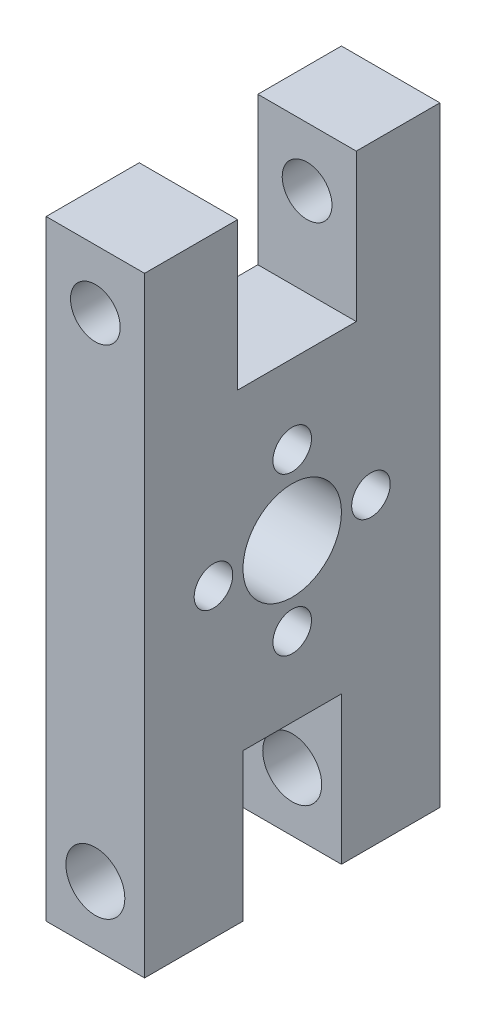
ISO-10303-21;
HEADER;
FILE_DESCRIPTION(('STEP AP214'),'2;1');
FILE_NAME('part.step','',(''),(''),'','','');
FILE_SCHEMA(('AUTOMOTIVE_DESIGN { 1 0 10303 214 1 1 1 1 }'));
ENDSEC;
DATA;
#1=APPLICATION_CONTEXT('core data for automotive mechanical design processes');
#2=APPLICATION_PROTOCOL_DEFINITION('international standard','automotive_design',2000,#1);
#3=PRODUCT_CONTEXT('',#1,'mechanical');
#4=PRODUCT('Part','Part','',(#3));
#5=PRODUCT_RELATED_PRODUCT_CATEGORY('part','',(#4));
#6=PRODUCT_DEFINITION_FORMATION('','',#4);
#7=PRODUCT_DEFINITION_CONTEXT('part definition',#1,'design');
#8=PRODUCT_DEFINITION('design','',#6,#7);
#9=PRODUCT_DEFINITION_SHAPE('','',#8);
#10=(LENGTH_UNIT() NAMED_UNIT(*) SI_UNIT(.MILLI.,.METRE.));
#11=(NAMED_UNIT(*) PLANE_ANGLE_UNIT() SI_UNIT($,.RADIAN.));
#12=(NAMED_UNIT(*) SI_UNIT($,.STERADIAN.) SOLID_ANGLE_UNIT());
#13=UNCERTAINTY_MEASURE_WITH_UNIT(LENGTH_MEASURE(1.E-05),#10,'distance_accuracy_value','');
#14=(GEOMETRIC_REPRESENTATION_CONTEXT(3) GLOBAL_UNCERTAINTY_ASSIGNED_CONTEXT((#13)) GLOBAL_UNIT_ASSIGNED_CONTEXT((#10,
#11,#12)) REPRESENTATION_CONTEXT('',''));
#15=CARTESIAN_POINT('',(0.,0.,0.));
#16=DIRECTION('',(0.,0.,1.));
#17=DIRECTION('',(1.,0.,0.));
#18=AXIS2_PLACEMENT_3D('',#15,#16,#17);
#19=CARTESIAN_POINT('',(10.,0.,0.));
#20=DIRECTION('',(-1.,0.,0.));
#21=DIRECTION('',(0.,0.,1.));
#22=AXIS2_PLACEMENT_3D('',#19,#20,#21);
#23=PLANE('',#22);
#24=DIRECTION('',(0.,0.,1.));
#25=VECTOR('',#24,1.);
#26=CARTESIAN_POINT('',(10.,31.,5.5420552748366));
#27=LINE('',#26,#25);
#28=CARTESIAN_POINT('',(10.,31.,5.5420552748366));
#29=VERTEX_POINT('',#28);
#30=CARTESIAN_POINT('',(10.,31.,15.));
#31=VERTEX_POINT('',#30);
#32=EDGE_CURVE('E191',#29,#31,#27,.T.);
#33=ORIENTED_EDGE('',*,*,#32,.T.);
#34=DIRECTION('',(0.,-1.,0.));
#35=VECTOR('',#34,1.);
#36=CARTESIAN_POINT('',(10.,-31.,15.));
#37=LINE('',#36,#35);
#38=CARTESIAN_POINT('',(10.,-31.,15.));
#39=VERTEX_POINT('',#38);
#40=EDGE_CURVE('E119',#31,#39,#37,.T.);
#41=ORIENTED_EDGE('',*,*,#40,.T.);
#42=DIRECTION('',(0.,0.,-1.));
#43=VECTOR('',#42,1.);
#44=CARTESIAN_POINT('',(10.,-31.,5.));
#45=LINE('',#44,#43);
#46=CARTESIAN_POINT('',(10.,-31.,5.));
#47=VERTEX_POINT('',#46);
#48=EDGE_CURVE('E219',#39,#47,#45,.T.);
#49=ORIENTED_EDGE('',*,*,#48,.T.);
#50=DIRECTION('',(0.,1.,0.));
#51=VECTOR('',#50,1.);
#52=CARTESIAN_POINT('',(10.,-31.,5.));
#53=LINE('',#52,#51);
#54=CARTESIAN_POINT('',(10.,-16.,5.));
#55=VERTEX_POINT('',#54);
#56=EDGE_CURVE('E238',#47,#55,#53,.T.);
#57=ORIENTED_EDGE('',*,*,#56,.T.);
#58=DIRECTION('',(0.,0.,-1.));
#59=VECTOR('',#58,1.);
#60=CARTESIAN_POINT('',(10.,-16.,5.));
#61=LINE('',#60,#59);
#62=CARTESIAN_POINT('',(10.,-16.,-5.));
#63=VERTEX_POINT('',#62);
#64=EDGE_CURVE('E235',#55,#63,#61,.T.);
#65=ORIENTED_EDGE('',*,*,#64,.T.);
#66=DIRECTION('',(0.,-1.,0.));
#67=VECTOR('',#66,1.);
#68=CARTESIAN_POINT('',(10.,-31.,-5.));
#69=LINE('',#68,#67);
#70=CARTESIAN_POINT('',(10.,-31.,-5.));
#71=VERTEX_POINT('',#70);
#72=EDGE_CURVE('E237',#63,#71,#69,.T.);
#73=ORIENTED_EDGE('',*,*,#72,.T.);
#74=DIRECTION('',(0.,0.,-1.));
#75=VECTOR('',#74,1.);
#76=CARTESIAN_POINT('',(10.,-31.,-15.));
#77=LINE('',#76,#75);
#78=CARTESIAN_POINT('',(10.,-31.,-15.));
#79=VERTEX_POINT('',#78);
#80=EDGE_CURVE('E240',#71,#79,#77,.T.);
#81=ORIENTED_EDGE('',*,*,#80,.T.);
#82=DIRECTION('',(0.,1.,0.));
#83=VECTOR('',#82,1.);
#84=CARTESIAN_POINT('',(10.,-31.,-15.));
#85=LINE('',#84,#83);
#86=CARTESIAN_POINT('',(10.,31.,-15.));
#87=VERTEX_POINT('',#86);
#88=EDGE_CURVE('E246',#79,#87,#85,.T.);
#89=ORIENTED_EDGE('',*,*,#88,.T.);
#90=DIRECTION('',(0.,0.,1.));
#91=VECTOR('',#90,1.);
#92=CARTESIAN_POINT('',(10.,31.,-15.));
#93=LINE('',#92,#91);
#94=CARTESIAN_POINT('',(10.,31.,-6.50834206963784));
#95=VERTEX_POINT('',#94);
#96=EDGE_CURVE('E150',#87,#95,#93,.T.);
#97=ORIENTED_EDGE('',*,*,#96,.T.);
#98=DIRECTION('',(0.,-1.,0.));
#99=VECTOR('',#98,1.);
#100=CARTESIAN_POINT('',(10.,31.,-6.50834206963784));
#101=LINE('',#100,#99);
#102=CARTESIAN_POINT('',(10.,16.,-6.50834206963784));
#103=VERTEX_POINT('',#102);
#104=EDGE_CURVE('E144',#95,#103,#101,.T.);
#105=ORIENTED_EDGE('',*,*,#104,.T.);
#106=DIRECTION('',(0.,0.,1.));
#107=VECTOR('',#106,1.);
#108=CARTESIAN_POINT('',(10.,16.,5.54205527483666));
#109=LINE('',#108,#107);
#110=CARTESIAN_POINT('',(10.,16.,5.54205527483666));
#111=VERTEX_POINT('',#110);
#112=EDGE_CURVE('E148',#103,#111,#109,.T.);
#113=ORIENTED_EDGE('',*,*,#112,.T.);
#114=DIRECTION('',(0.,1.,0.));
#115=VECTOR('',#114,1.);
#116=CARTESIAN_POINT('',(10.,31.,5.5420552748366));
#117=LINE('',#116,#115);
#118=EDGE_CURVE('E64',#111,#29,#117,.T.);
#119=ORIENTED_EDGE('',*,*,#118,.T.);
#120=EDGE_LOOP('',(#33,#41,#49,#57,#65,#73,#81,#89,#97,#105,#113,#119));
#121=FACE_BOUND('',#120,.T.);
#122=CARTESIAN_POINT('',(10.,0.,0.));
#123=DIRECTION('',(1.,0.,0.));
#124=DIRECTION('',(0.,0.,-1.));
#125=AXIS2_PLACEMENT_3D('',#122,#123,#124);
#126=CIRCLE('',#125,5.);
#127=CARTESIAN_POINT('',(10.,0.,-5.));
#128=VERTEX_POINT('',#127);
#129=EDGE_CURVE('E172',#128,#128,#126,.T.);
#130=ORIENTED_EDGE('',*,*,#129,.F.);
#131=EDGE_LOOP('',(#130));
#132=FACE_BOUND('',#131,.T.);
#133=CARTESIAN_POINT('',(10.,0.,7.99999999999999));
#134=DIRECTION('',(1.,0.,0.));
#135=DIRECTION('',(0.,0.,-1.));
#136=AXIS2_PLACEMENT_3D('',#133,#134,#135);
#137=CIRCLE('',#136,1.95828142992277);
#138=CARTESIAN_POINT('',(10.,0.,6.04171857007723));
#139=VERTEX_POINT('',#138);
#140=EDGE_CURVE('E353',#139,#139,#137,.T.);
#141=ORIENTED_EDGE('',*,*,#140,.F.);
#142=EDGE_LOOP('',(#141));
#143=FACE_BOUND('',#142,.T.);
#144=CARTESIAN_POINT('',(10.,8.,0.));
#145=DIRECTION('',(1.,0.,0.));
#146=DIRECTION('',(0.,0.,-1.));
#147=AXIS2_PLACEMENT_3D('',#144,#145,#146);
#148=CIRCLE('',#147,1.95828142992276);
#149=CARTESIAN_POINT('',(10.,8.,-1.95828142992279));
#150=VERTEX_POINT('',#149);
#151=EDGE_CURVE('E347',#150,#150,#148,.T.);
#152=ORIENTED_EDGE('',*,*,#151,.F.);
#153=EDGE_LOOP('',(#152));
#154=FACE_BOUND('',#153,.T.);
#155=CARTESIAN_POINT('',(10.,0.,-7.99999999999999));
#156=DIRECTION('',(1.,0.,0.));
#157=DIRECTION('',(0.,0.,-1.));
#158=AXIS2_PLACEMENT_3D('',#155,#156,#157);
#159=CIRCLE('',#158,1.95828142992277);
#160=CARTESIAN_POINT('',(10.,0.,-9.95828142992276));
#161=VERTEX_POINT('',#160);
#162=EDGE_CURVE('E341',#161,#161,#159,.T.);
#163=ORIENTED_EDGE('',*,*,#162,.F.);
#164=EDGE_LOOP('',(#163));
#165=FACE_BOUND('',#164,.T.);
#166=CARTESIAN_POINT('',(10.,-8.,0.));
#167=DIRECTION('',(1.,0.,0.));
#168=DIRECTION('',(0.,0.,-1.));
#169=AXIS2_PLACEMENT_3D('',#166,#167,#168);
#170=CIRCLE('',#169,1.95828142992277);
#171=CARTESIAN_POINT('',(10.,-8.,-1.95828142992268));
#172=VERTEX_POINT('',#171);
#173=EDGE_CURVE('E335',#172,#172,#170,.T.);
#174=ORIENTED_EDGE('',*,*,#173,.F.);
#175=EDGE_LOOP('',(#174));
#176=FACE_BOUND('',#175,.T.);
#177=ADVANCED_FACE('F46',(#121,#132,#143,#154,#165,#176),#23,.F.);
#178=CARTESIAN_POINT('',(0.,0.,0.));
#179=DIRECTION('',(-1.,0.,0.));
#180=DIRECTION('',(0.,0.,1.));
#181=AXIS2_PLACEMENT_3D('',#178,#179,#180);
#182=PLANE('',#181);
#183=CARTESIAN_POINT('',(0.,0.,-7.99999999999999));
#184=DIRECTION('',(1.,0.,0.));
#185=DIRECTION('',(0.,0.,-1.));
#186=AXIS2_PLACEMENT_3D('',#183,#184,#185);
#187=CIRCLE('',#186,1.95828142992277);
#188=CARTESIAN_POINT('',(0.,0.,-9.95828142992276));
#189=VERTEX_POINT('',#188);
#190=EDGE_CURVE('E338',#189,#189,#187,.T.);
#191=ORIENTED_EDGE('',*,*,#190,.T.);
#192=EDGE_LOOP('',(#191));
#193=FACE_BOUND('',#192,.T.);
#194=CARTESIAN_POINT('',(0.,0.,7.99999999999999));
#195=DIRECTION('',(1.,0.,0.));
#196=DIRECTION('',(0.,0.,-1.));
#197=AXIS2_PLACEMENT_3D('',#194,#195,#196);
#198=CIRCLE('',#197,1.95828142992277);
#199=CARTESIAN_POINT('',(0.,0.,6.04171857007723));
#200=VERTEX_POINT('',#199);
#201=EDGE_CURVE('E350',#200,#200,#198,.T.);
#202=ORIENTED_EDGE('',*,*,#201,.T.);
#203=EDGE_LOOP('',(#202));
#204=FACE_BOUND('',#203,.T.);
#205=DIRECTION('',(0.,0.,1.));
#206=VECTOR('',#205,1.);
#207=CARTESIAN_POINT('',(0.,31.,5.5420552748366));
#208=LINE('',#207,#206);
#209=CARTESIAN_POINT('',(0.,31.,5.5420552748366));
#210=VERTEX_POINT('',#209);
#211=CARTESIAN_POINT('',(0.,31.,15.));
#212=VERTEX_POINT('',#211);
#213=EDGE_CURVE('E168',#210,#212,#208,.T.);
#214=ORIENTED_EDGE('',*,*,#213,.F.);
#215=DIRECTION('',(0.,1.,0.));
#216=VECTOR('',#215,1.);
#217=CARTESIAN_POINT('',(0.,31.,5.5420552748366));
#218=LINE('',#217,#216);
#219=CARTESIAN_POINT('',(0.,16.,5.54205527483666));
#220=VERTEX_POINT('',#219);
#221=EDGE_CURVE('E111',#220,#210,#218,.T.);
#222=ORIENTED_EDGE('',*,*,#221,.F.);
#223=DIRECTION('',(0.,0.,1.));
#224=VECTOR('',#223,1.);
#225=CARTESIAN_POINT('',(0.,16.,5.54205527483666));
#226=LINE('',#225,#224);
#227=CARTESIAN_POINT('',(0.,16.,-6.50834206963784));
#228=VERTEX_POINT('',#227);
#229=EDGE_CURVE('E105',#228,#220,#226,.T.);
#230=ORIENTED_EDGE('',*,*,#229,.F.);
#231=DIRECTION('',(0.,-1.,0.));
#232=VECTOR('',#231,1.);
#233=CARTESIAN_POINT('',(0.,31.,-6.50834206963784));
#234=LINE('',#233,#232);
#235=CARTESIAN_POINT('',(0.,31.,-6.50834206963784));
#236=VERTEX_POINT('',#235);
#237=EDGE_CURVE('E158',#236,#228,#234,.T.);
#238=ORIENTED_EDGE('',*,*,#237,.F.);
#239=DIRECTION('',(0.,0.,1.));
#240=VECTOR('',#239,1.);
#241=CARTESIAN_POINT('',(0.,31.,-15.));
#242=LINE('',#241,#240);
#243=CARTESIAN_POINT('',(0.,31.,-15.));
#244=VERTEX_POINT('',#243);
#245=EDGE_CURVE('E186',#244,#236,#242,.T.);
#246=ORIENTED_EDGE('',*,*,#245,.F.);
#247=DIRECTION('',(0.,1.,0.));
#248=VECTOR('',#247,1.);
#249=CARTESIAN_POINT('',(0.,-31.,-15.));
#250=LINE('',#249,#248);
#251=CARTESIAN_POINT('',(0.,-31.,-15.));
#252=VERTEX_POINT('',#251);
#253=EDGE_CURVE('E184',#252,#244,#250,.T.);
#254=ORIENTED_EDGE('',*,*,#253,.F.);
#255=DIRECTION('',(0.,0.,-1.));
#256=VECTOR('',#255,1.);
#257=CARTESIAN_POINT('',(0.,-31.,-15.));
#258=LINE('',#257,#256);
#259=CARTESIAN_POINT('',(0.,-31.,-5.));
#260=VERTEX_POINT('',#259);
#261=EDGE_CURVE('E182',#260,#252,#258,.T.);
#262=ORIENTED_EDGE('',*,*,#261,.F.);
#263=DIRECTION('',(0.,-1.,0.));
#264=VECTOR('',#263,1.);
#265=CARTESIAN_POINT('',(0.,-31.,-5.));
#266=LINE('',#265,#264);
#267=CARTESIAN_POINT('',(0.,-16.,-5.));
#268=VERTEX_POINT('',#267);
#269=EDGE_CURVE('E180',#268,#260,#266,.T.);
#270=ORIENTED_EDGE('',*,*,#269,.F.);
#271=DIRECTION('',(0.,0.,-1.));
#272=VECTOR('',#271,1.);
#273=CARTESIAN_POINT('',(0.,-16.,5.));
#274=LINE('',#273,#272);
#275=CARTESIAN_POINT('',(0.,-16.,5.));
#276=VERTEX_POINT('',#275);
#277=EDGE_CURVE('E178',#276,#268,#274,.T.);
#278=ORIENTED_EDGE('',*,*,#277,.F.);
#279=DIRECTION('',(0.,1.,0.));
#280=VECTOR('',#279,1.);
#281=CARTESIAN_POINT('',(0.,-31.,5.));
#282=LINE('',#281,#280);
#283=CARTESIAN_POINT('',(0.,-31.,5.));
#284=VERTEX_POINT('',#283);
#285=EDGE_CURVE('E176',#284,#276,#282,.T.);
#286=ORIENTED_EDGE('',*,*,#285,.F.);
#287=DIRECTION('',(0.,0.,-1.));
#288=VECTOR('',#287,1.);
#289=CARTESIAN_POINT('',(0.,-31.,5.));
#290=LINE('',#289,#288);
#291=CARTESIAN_POINT('',(0.,-31.,15.));
#292=VERTEX_POINT('',#291);
#293=EDGE_CURVE('E174',#292,#284,#290,.T.);
#294=ORIENTED_EDGE('',*,*,#293,.F.);
#295=DIRECTION('',(0.,-1.,0.));
#296=VECTOR('',#295,1.);
#297=CARTESIAN_POINT('',(0.,-31.,15.));
#298=LINE('',#297,#296);
#299=EDGE_CURVE('E171',#212,#292,#298,.T.);
#300=ORIENTED_EDGE('',*,*,#299,.F.);
#301=EDGE_LOOP('',(#214,#222,#230,#238,#246,#254,#262,#270,#278,#286,#294,#300));
#302=FACE_BOUND('',#301,.T.);
#303=CARTESIAN_POINT('',(0.,0.,0.));
#304=DIRECTION('',(1.,0.,0.));
#305=DIRECTION('',(0.,0.,-1.));
#306=AXIS2_PLACEMENT_3D('',#303,#304,#305);
#307=CIRCLE('',#306,5.);
#308=CARTESIAN_POINT('',(0.,0.,-5.));
#309=VERTEX_POINT('',#308);
#310=EDGE_CURVE('E356',#309,#309,#307,.T.);
#311=ORIENTED_EDGE('',*,*,#310,.T.);
#312=EDGE_LOOP('',(#311));
#313=FACE_BOUND('',#312,.T.);
#314=CARTESIAN_POINT('',(0.,8.,0.));
#315=DIRECTION('',(1.,0.,0.));
#316=DIRECTION('',(0.,0.,-1.));
#317=AXIS2_PLACEMENT_3D('',#314,#315,#316);
#318=CIRCLE('',#317,1.95828142992276);
#319=CARTESIAN_POINT('',(0.,8.,-1.95828142992279));
#320=VERTEX_POINT('',#319);
#321=EDGE_CURVE('E344',#320,#320,#318,.T.);
#322=ORIENTED_EDGE('',*,*,#321,.T.);
#323=EDGE_LOOP('',(#322));
#324=FACE_BOUND('',#323,.T.);
#325=CARTESIAN_POINT('',(0.,-8.,0.));
#326=DIRECTION('',(1.,0.,0.));
#327=DIRECTION('',(0.,0.,-1.));
#328=AXIS2_PLACEMENT_3D('',#325,#326,#327);
#329=CIRCLE('',#328,1.95828142992277);
#330=CARTESIAN_POINT('',(0.,-8.,-1.95828142992268));
#331=VERTEX_POINT('',#330);
#332=EDGE_CURVE('E334',#331,#331,#329,.T.);
#333=ORIENTED_EDGE('',*,*,#332,.T.);
#334=EDGE_LOOP('',(#333));
#335=FACE_BOUND('',#334,.T.);
#336=ADVANCED_FACE('F223',(#193,#204,#302,#313,#324,#335),#182,.T.);
#337=CARTESIAN_POINT('',(10.,31.,5.5420552748366));
#338=DIRECTION('',(0.,-1.,0.));
#339=DIRECTION('',(0.,0.,-1.));
#340=AXIS2_PLACEMENT_3D('',#337,#338,#339);
#341=PLANE('',#340);
#342=ORIENTED_EDGE('',*,*,#213,.T.);
#343=DIRECTION('',(-1.,0.,0.));
#344=VECTOR('',#343,1.);
#345=CARTESIAN_POINT('',(10.,31.,15.));
#346=LINE('',#345,#344);
#347=EDGE_CURVE('E13',#31,#212,#346,.T.);
#348=ORIENTED_EDGE('',*,*,#347,.F.);
#349=ORIENTED_EDGE('',*,*,#32,.F.);
#350=DIRECTION('',(-1.,0.,0.));
#351=VECTOR('',#350,1.);
#352=CARTESIAN_POINT('',(10.,31.,5.5420552748366));
#353=LINE('',#352,#351);
#354=EDGE_CURVE('E164',#29,#210,#353,.T.);
#355=ORIENTED_EDGE('',*,*,#354,.T.);
#356=EDGE_LOOP('',(#342,#348,#349,#355));
#357=FACE_BOUND('',#356,.T.);
#358=ADVANCED_FACE('F48',(#357),#341,.F.);
#359=CARTESIAN_POINT('',(10.,-31.,15.));
#360=DIRECTION('',(0.,0.,-1.));
#361=DIRECTION('',(-1.,0.,0.));
#362=AXIS2_PLACEMENT_3D('',#359,#360,#361);
#363=PLANE('',#362);
#364=CARTESIAN_POINT('',(5.,-25.,15.));
#365=DIRECTION('',(0.,0.,1.));
#366=DIRECTION('',(1.,0.,0.));
#367=AXIS2_PLACEMENT_3D('',#364,#365,#366);
#368=CIRCLE('',#367,2.99463892889007);
#369=CARTESIAN_POINT('',(7.99463892889008,-25.,15.));
#370=VERTEX_POINT('',#369);
#371=EDGE_CURVE('E313',#370,#370,#368,.T.);
#372=ORIENTED_EDGE('',*,*,#371,.F.);
#373=EDGE_LOOP('',(#372));
#374=FACE_BOUND('',#373,.T.);
#375=CARTESIAN_POINT('',(5.,25.,15.));
#376=DIRECTION('',(0.,0.,1.));
#377=DIRECTION('',(1.,0.,0.));
#378=AXIS2_PLACEMENT_3D('',#375,#376,#377);
#379=CIRCLE('',#378,2.5264474911645);
#380=CARTESIAN_POINT('',(7.52644749116451,25.,15.));
#381=VERTEX_POINT('',#380);
#382=EDGE_CURVE('E318',#381,#381,#379,.T.);
#383=ORIENTED_EDGE('',*,*,#382,.F.);
#384=EDGE_LOOP('',(#383));
#385=FACE_BOUND('',#384,.T.);
#386=ORIENTED_EDGE('',*,*,#299,.T.);
#387=DIRECTION('',(-1.,0.,0.));
#388=VECTOR('',#387,1.);
#389=CARTESIAN_POINT('',(10.,-31.,15.));
#390=LINE('',#389,#388);
#391=EDGE_CURVE('E56',#39,#292,#390,.T.);
#392=ORIENTED_EDGE('',*,*,#391,.F.);
#393=ORIENTED_EDGE('',*,*,#40,.F.);
#394=ORIENTED_EDGE('',*,*,#347,.T.);
#395=EDGE_LOOP('',(#386,#392,#393,#394));
#396=FACE_BOUND('',#395,.T.);
#397=ADVANCED_FACE('F396',(#374,#385,#396),#363,.F.);
#398=CARTESIAN_POINT('',(10.,-31.,5.));
#399=DIRECTION('',(0.,1.,0.));
#400=DIRECTION('',(0.,0.,1.));
#401=AXIS2_PLACEMENT_3D('',#398,#399,#400);
#402=PLANE('',#401);
#403=ORIENTED_EDGE('',*,*,#293,.T.);
#404=DIRECTION('',(-1.,0.,0.));
#405=VECTOR('',#404,1.);
#406=CARTESIAN_POINT('',(10.,-31.,5.));
#407=LINE('',#406,#405);
#408=EDGE_CURVE('E210',#47,#284,#407,.T.);
#409=ORIENTED_EDGE('',*,*,#408,.F.);
#410=ORIENTED_EDGE('',*,*,#48,.F.);
#411=ORIENTED_EDGE('',*,*,#391,.T.);
#412=EDGE_LOOP('',(#403,#409,#410,#411));
#413=FACE_BOUND('',#412,.T.);
#414=ADVANCED_FACE('F217',(#413),#402,.F.);
#415=CARTESIAN_POINT('',(10.,-31.,5.));
#416=DIRECTION('',(0.,0.,1.));
#417=DIRECTION('',(1.,0.,0.));
#418=AXIS2_PLACEMENT_3D('',#415,#416,#417);
#419=PLANE('',#418);
#420=CARTESIAN_POINT('',(5.,-25.,5.));
#421=DIRECTION('',(0.,0.,1.));
#422=DIRECTION('',(1.,0.,0.));
#423=AXIS2_PLACEMENT_3D('',#420,#421,#422);
#424=CIRCLE('',#423,2.99463892889007);
#425=CARTESIAN_POINT('',(7.99463892889008,-25.,5.));
#426=VERTEX_POINT('',#425);
#427=EDGE_CURVE('E316',#426,#426,#424,.T.);
#428=ORIENTED_EDGE('',*,*,#427,.T.);
#429=EDGE_LOOP('',(#428));
#430=FACE_BOUND('',#429,.T.);
#431=ORIENTED_EDGE('',*,*,#285,.T.);
#432=DIRECTION('',(-1.,0.,0.));
#433=VECTOR('',#432,1.);
#434=CARTESIAN_POINT('',(10.,-16.,5.));
#435=LINE('',#434,#433);
#436=EDGE_CURVE('E207',#55,#276,#435,.T.);
#437=ORIENTED_EDGE('',*,*,#436,.F.);
#438=ORIENTED_EDGE('',*,*,#56,.F.);
#439=ORIENTED_EDGE('',*,*,#408,.T.);
#440=EDGE_LOOP('',(#431,#437,#438,#439));
#441=FACE_BOUND('',#440,.T.);
#442=ADVANCED_FACE('F229',(#430,#441),#419,.F.);
#443=CARTESIAN_POINT('',(10.,-16.,5.));
#444=DIRECTION('',(0.,1.,0.));
#445=DIRECTION('',(0.,0.,1.));
#446=AXIS2_PLACEMENT_3D('',#443,#444,#445);
#447=PLANE('',#446);
#448=ORIENTED_EDGE('',*,*,#277,.T.);
#449=DIRECTION('',(-1.,0.,0.));
#450=VECTOR('',#449,1.);
#451=CARTESIAN_POINT('',(10.,-16.,-5.));
#452=LINE('',#451,#450);
#453=EDGE_CURVE('E204',#63,#268,#452,.T.);
#454=ORIENTED_EDGE('',*,*,#453,.F.);
#455=ORIENTED_EDGE('',*,*,#64,.F.);
#456=ORIENTED_EDGE('',*,*,#436,.T.);
#457=EDGE_LOOP('',(#448,#454,#455,#456));
#458=FACE_BOUND('',#457,.T.);
#459=ADVANCED_FACE('F233',(#458),#447,.F.);
#460=CARTESIAN_POINT('',(10.,-31.,-5.));
#461=DIRECTION('',(0.,0.,-1.));
#462=DIRECTION('',(-1.,0.,0.));
#463=AXIS2_PLACEMENT_3D('',#460,#461,#462);
#464=PLANE('',#463);
#465=CARTESIAN_POINT('',(5.,-25.,-5.));
#466=DIRECTION('',(0.,0.,-1.));
#467=DIRECTION('',(-1.,0.,0.));
#468=AXIS2_PLACEMENT_3D('',#465,#466,#467);
#469=CIRCLE('',#468,2.99463892889007);
#470=CARTESIAN_POINT('',(2.00536107110993,-25.,-5.));
#471=VERTEX_POINT('',#470);
#472=EDGE_CURVE('E319',#471,#471,#469,.T.);
#473=ORIENTED_EDGE('',*,*,#472,.T.);
#474=EDGE_LOOP('',(#473));
#475=FACE_BOUND('',#474,.T.);
#476=ORIENTED_EDGE('',*,*,#269,.T.);
#477=DIRECTION('',(-1.,0.,0.));
#478=VECTOR('',#477,1.);
#479=CARTESIAN_POINT('',(10.,-31.,-5.));
#480=LINE('',#479,#478);
#481=EDGE_CURVE('E201',#71,#260,#480,.T.);
#482=ORIENTED_EDGE('',*,*,#481,.F.);
#483=ORIENTED_EDGE('',*,*,#72,.F.);
#484=ORIENTED_EDGE('',*,*,#453,.T.);
#485=EDGE_LOOP('',(#476,#482,#483,#484));
#486=FACE_BOUND('',#485,.T.);
#487=ADVANCED_FACE('F409',(#475,#486),#464,.F.);
#488=CARTESIAN_POINT('',(10.,-31.,-15.));
#489=DIRECTION('',(0.,1.,0.));
#490=DIRECTION('',(0.,0.,1.));
#491=AXIS2_PLACEMENT_3D('',#488,#489,#490);
#492=PLANE('',#491);
#493=ORIENTED_EDGE('',*,*,#261,.T.);
#494=DIRECTION('',(-1.,0.,0.));
#495=VECTOR('',#494,1.);
#496=CARTESIAN_POINT('',(10.,-31.,-15.));
#497=LINE('',#496,#495);
#498=EDGE_CURVE('E198',#79,#252,#497,.T.);
#499=ORIENTED_EDGE('',*,*,#498,.F.);
#500=ORIENTED_EDGE('',*,*,#80,.F.);
#501=ORIENTED_EDGE('',*,*,#481,.T.);
#502=EDGE_LOOP('',(#493,#499,#500,#501));
#503=FACE_BOUND('',#502,.T.);
#504=ADVANCED_FACE('F412',(#503),#492,.F.);
#505=CARTESIAN_POINT('',(10.,-31.,-15.));
#506=DIRECTION('',(0.,0.,1.));
#507=DIRECTION('',(1.,0.,0.));
#508=AXIS2_PLACEMENT_3D('',#505,#506,#507);
#509=PLANE('',#508);
#510=CARTESIAN_POINT('',(5.,-25.,-15.));
#511=DIRECTION('',(0.,0.,1.));
#512=DIRECTION('',(1.,0.,0.));
#513=AXIS2_PLACEMENT_3D('',#510,#511,#512);
#514=CIRCLE('',#513,2.99463892889007);
#515=CARTESIAN_POINT('',(7.99463892889008,-25.,-15.));
#516=VERTEX_POINT('',#515);
#517=EDGE_CURVE('E325',#516,#516,#514,.T.);
#518=ORIENTED_EDGE('',*,*,#517,.T.);
#519=EDGE_LOOP('',(#518));
#520=FACE_BOUND('',#519,.T.);
#521=CARTESIAN_POINT('',(5.,25.,-15.));
#522=DIRECTION('',(0.,0.,1.));
#523=DIRECTION('',(1.,0.,0.));
#524=AXIS2_PLACEMENT_3D('',#521,#522,#523);
#525=CIRCLE('',#524,2.5264474911645);
#526=CARTESIAN_POINT('',(7.52644749116451,25.,-15.));
#527=VERTEX_POINT('',#526);
#528=EDGE_CURVE('E322',#527,#527,#525,.T.);
#529=ORIENTED_EDGE('',*,*,#528,.T.);
#530=EDGE_LOOP('',(#529));
#531=FACE_BOUND('',#530,.T.);
#532=ORIENTED_EDGE('',*,*,#253,.T.);
#533=DIRECTION('',(-1.,0.,0.));
#534=VECTOR('',#533,1.);
#535=CARTESIAN_POINT('',(10.,31.,-15.));
#536=LINE('',#535,#534);
#537=EDGE_CURVE('E195',#87,#244,#536,.T.);
#538=ORIENTED_EDGE('',*,*,#537,.F.);
#539=ORIENTED_EDGE('',*,*,#88,.F.);
#540=ORIENTED_EDGE('',*,*,#498,.T.);
#541=EDGE_LOOP('',(#532,#538,#539,#540));
#542=FACE_BOUND('',#541,.T.);
#543=ADVANCED_FACE('F252',(#520,#531,#542),#509,.F.);
#544=CARTESIAN_POINT('',(10.,31.,-15.));
#545=DIRECTION('',(0.,-1.,0.));
#546=DIRECTION('',(0.,0.,-1.));
#547=AXIS2_PLACEMENT_3D('',#544,#545,#546);
#548=PLANE('',#547);
#549=ORIENTED_EDGE('',*,*,#245,.T.);
#550=DIRECTION('',(-1.,0.,0.));
#551=VECTOR('',#550,1.);
#552=CARTESIAN_POINT('',(10.,31.,-6.50834206963784));
#553=LINE('',#552,#551);
#554=EDGE_CURVE('E159',#95,#236,#553,.T.);
#555=ORIENTED_EDGE('',*,*,#554,.F.);
#556=ORIENTED_EDGE('',*,*,#96,.F.);
#557=ORIENTED_EDGE('',*,*,#537,.T.);
#558=EDGE_LOOP('',(#549,#555,#556,#557));
#559=FACE_BOUND('',#558,.T.);
#560=ADVANCED_FACE('F256',(#559),#548,.F.);
#561=CARTESIAN_POINT('',(10.,31.,-6.50834206963784));
#562=DIRECTION('',(0.,0.,-1.));
#563=DIRECTION('',(0.,1.,0.));
#564=AXIS2_PLACEMENT_3D('',#561,#562,#563);
#565=PLANE('',#564);
#566=CARTESIAN_POINT('',(5.,25.,-6.50834206963784));
#567=DIRECTION('',(0.,0.,-1.));
#568=DIRECTION('',(0.,1.,0.));
#569=AXIS2_PLACEMENT_3D('',#566,#567,#568);
#570=CIRCLE('',#569,2.5264474911645);
#571=CARTESIAN_POINT('',(5.,27.5264474911645,-6.50834206963784));
#572=VERTEX_POINT('',#571);
#573=EDGE_CURVE('E331',#572,#572,#570,.T.);
#574=ORIENTED_EDGE('',*,*,#573,.T.);
#575=EDGE_LOOP('',(#574));
#576=FACE_BOUND('',#575,.T.);
#577=ORIENTED_EDGE('',*,*,#237,.T.);
#578=DIRECTION('',(-1.,0.,0.));
#579=VECTOR('',#578,1.);
#580=CARTESIAN_POINT('',(10.,16.,-6.50834206963784));
#581=LINE('',#580,#579);
#582=EDGE_CURVE('E155',#103,#228,#581,.T.);
#583=ORIENTED_EDGE('',*,*,#582,.F.);
#584=ORIENTED_EDGE('',*,*,#104,.F.);
#585=ORIENTED_EDGE('',*,*,#554,.T.);
#586=EDGE_LOOP('',(#577,#583,#584,#585));
#587=FACE_BOUND('',#586,.T.);
#588=ADVANCED_FACE('F156',(#576,#587),#565,.F.);
#589=CARTESIAN_POINT('',(10.,16.,5.54205527483666));
#590=DIRECTION('',(0.,-1.,0.));
#591=DIRECTION('',(0.,0.,-1.));
#592=AXIS2_PLACEMENT_3D('',#589,#590,#591);
#593=PLANE('',#592);
#594=ORIENTED_EDGE('',*,*,#229,.T.);
#595=DIRECTION('',(-1.,0.,0.));
#596=VECTOR('',#595,1.);
#597=CARTESIAN_POINT('',(10.,16.,5.54205527483666));
#598=LINE('',#597,#596);
#599=EDGE_CURVE('E160',#111,#220,#598,.T.);
#600=ORIENTED_EDGE('',*,*,#599,.F.);
#601=ORIENTED_EDGE('',*,*,#112,.F.);
#602=ORIENTED_EDGE('',*,*,#582,.T.);
#603=EDGE_LOOP('',(#594,#600,#601,#602));
#604=FACE_BOUND('',#603,.T.);
#605=ADVANCED_FACE('F162',(#604),#593,.F.);
#606=CARTESIAN_POINT('',(10.,31.,5.5420552748366));
#607=DIRECTION('',(0.,0.,1.));
#608=DIRECTION('',(0.,-1.,0.));
#609=AXIS2_PLACEMENT_3D('',#606,#607,#608);
#610=PLANE('',#609);
#611=CARTESIAN_POINT('',(5.,25.,5.54205527483663));
#612=DIRECTION('',(0.,0.,1.));
#613=DIRECTION('',(0.,-1.,0.));
#614=AXIS2_PLACEMENT_3D('',#611,#612,#613);
#615=CIRCLE('',#614,2.5264474911645);
#616=CARTESIAN_POINT('',(5.,22.4735525088355,5.54205527483664));
#617=VERTEX_POINT('',#616);
#618=EDGE_CURVE('E50',#617,#617,#615,.T.);
#619=ORIENTED_EDGE('',*,*,#618,.T.);
#620=EDGE_LOOP('',(#619));
#621=FACE_BOUND('',#620,.T.);
#622=ORIENTED_EDGE('',*,*,#221,.T.);
#623=ORIENTED_EDGE('',*,*,#354,.F.);
#624=ORIENTED_EDGE('',*,*,#118,.F.);
#625=ORIENTED_EDGE('',*,*,#599,.T.);
#626=EDGE_LOOP('',(#622,#623,#624,#625));
#627=FACE_BOUND('',#626,.T.);
#628=ADVANCED_FACE('F260',(#621,#627),#610,.F.);
#629=CARTESIAN_POINT('',(10.,0.,0.));
#630=DIRECTION('',(-1.,0.,0.));
#631=DIRECTION('',(0.,0.,1.));
#632=AXIS2_PLACEMENT_3D('',#629,#630,#631);
#633=CYLINDRICAL_SURFACE('',#632,5.);
#634=ORIENTED_EDGE('',*,*,#129,.T.);
#635=EDGE_LOOP('',(#634));
#636=FACE_BOUND('',#635,.T.);
#637=ORIENTED_EDGE('',*,*,#310,.F.);
#638=EDGE_LOOP('',(#637));
#639=FACE_BOUND('',#638,.T.);
#640=ADVANCED_FACE('F262',(#636,#639),#633,.F.);
#641=CARTESIAN_POINT('',(10.,0.,7.99999999999999));
#642=DIRECTION('',(-1.,0.,0.));
#643=DIRECTION('',(0.,0.,1.));
#644=AXIS2_PLACEMENT_3D('',#641,#642,#643);
#645=CYLINDRICAL_SURFACE('',#644,1.95828142992277);
#646=ORIENTED_EDGE('',*,*,#140,.T.);
#647=EDGE_LOOP('',(#646));
#648=FACE_BOUND('',#647,.T.);
#649=ORIENTED_EDGE('',*,*,#201,.F.);
#650=EDGE_LOOP('',(#649));
#651=FACE_BOUND('',#650,.T.);
#652=ADVANCED_FACE('F269',(#648,#651),#645,.F.);
#653=CARTESIAN_POINT('',(10.,8.,0.));
#654=DIRECTION('',(-1.,0.,0.));
#655=DIRECTION('',(0.,0.,1.));
#656=AXIS2_PLACEMENT_3D('',#653,#654,#655);
#657=CYLINDRICAL_SURFACE('',#656,1.95828142992276);
#658=ORIENTED_EDGE('',*,*,#151,.T.);
#659=EDGE_LOOP('',(#658));
#660=FACE_BOUND('',#659,.T.);
#661=ORIENTED_EDGE('',*,*,#321,.F.);
#662=EDGE_LOOP('',(#661));
#663=FACE_BOUND('',#662,.T.);
#664=ADVANCED_FACE('F284',(#660,#663),#657,.F.);
#665=CARTESIAN_POINT('',(10.,0.,-7.99999999999999));
#666=DIRECTION('',(-1.,0.,0.));
#667=DIRECTION('',(0.,0.,1.));
#668=AXIS2_PLACEMENT_3D('',#665,#666,#667);
#669=CYLINDRICAL_SURFACE('',#668,1.95828142992277);
#670=ORIENTED_EDGE('',*,*,#162,.T.);
#671=EDGE_LOOP('',(#670));
#672=FACE_BOUND('',#671,.T.);
#673=ORIENTED_EDGE('',*,*,#190,.F.);
#674=EDGE_LOOP('',(#673));
#675=FACE_BOUND('',#674,.T.);
#676=ADVANCED_FACE('F288',(#672,#675),#669,.F.);
#677=CARTESIAN_POINT('',(10.,-8.,0.));
#678=DIRECTION('',(-1.,0.,0.));
#679=DIRECTION('',(0.,0.,1.));
#680=AXIS2_PLACEMENT_3D('',#677,#678,#679);
#681=CYLINDRICAL_SURFACE('',#680,1.95828142992277);
#682=ORIENTED_EDGE('',*,*,#173,.T.);
#683=EDGE_LOOP('',(#682));
#684=FACE_BOUND('',#683,.T.);
#685=ORIENTED_EDGE('',*,*,#332,.F.);
#686=EDGE_LOOP('',(#685));
#687=FACE_BOUND('',#686,.T.);
#688=ADVANCED_FACE('F292',(#684,#687),#681,.F.);
#689=CARTESIAN_POINT('',(5.,25.,-15.));
#690=DIRECTION('',(0.,0.,1.));
#691=DIRECTION('',(1.,0.,0.));
#692=AXIS2_PLACEMENT_3D('',#689,#690,#691);
#693=CYLINDRICAL_SURFACE('',#692,2.5264474911645);
#694=ORIENTED_EDGE('',*,*,#382,.T.);
#695=EDGE_LOOP('',(#694));
#696=FACE_BOUND('',#695,.T.);
#697=ORIENTED_EDGE('',*,*,#618,.F.);
#698=EDGE_LOOP('',(#697));
#699=FACE_BOUND('',#698,.T.);
#700=ADVANCED_FACE('F296',(#696,#699),#693,.F.);
#701=ORIENTED_EDGE('',*,*,#528,.F.);
#702=EDGE_LOOP('',(#701));
#703=FACE_BOUND('',#702,.T.);
#704=ORIENTED_EDGE('',*,*,#573,.F.);
#705=EDGE_LOOP('',(#704));
#706=FACE_BOUND('',#705,.T.);
#707=ADVANCED_FACE('F298',(#703,#706),#693,.F.);
#708=CARTESIAN_POINT('',(5.,-25.,-15.));
#709=DIRECTION('',(0.,0.,1.));
#710=DIRECTION('',(1.,0.,0.));
#711=AXIS2_PLACEMENT_3D('',#708,#709,#710);
#712=CYLINDRICAL_SURFACE('',#711,2.99463892889007);
#713=ORIENTED_EDGE('',*,*,#517,.F.);
#714=EDGE_LOOP('',(#713));
#715=FACE_BOUND('',#714,.T.);
#716=ORIENTED_EDGE('',*,*,#472,.F.);
#717=EDGE_LOOP('',(#716));
#718=FACE_BOUND('',#717,.T.);
#719=ADVANCED_FACE('F301',(#715,#718),#712,.F.);
#720=ORIENTED_EDGE('',*,*,#371,.T.);
#721=EDGE_LOOP('',(#720));
#722=FACE_BOUND('',#721,.T.);
#723=ORIENTED_EDGE('',*,*,#427,.F.);
#724=EDGE_LOOP('',(#723));
#725=FACE_BOUND('',#724,.T.);
#726=ADVANCED_FACE('F303',(#722,#725),#712,.F.);
#727=CLOSED_SHELL('',(#177,#336,#358,#397,#414,#442,#459,#487,#504,#543,#560,#588,#605,#628,
#640,#652,#664,#676,#688,#700,#707,#719,#726));
#728=MANIFOLD_SOLID_BREP('B2',#727);
#729=ADVANCED_BREP_SHAPE_REPRESENTATION('',(#18,#728),#14);
#730=SHAPE_DEFINITION_REPRESENTATION(#9,#729);
ENDSEC;
END-ISO-10303-21;
